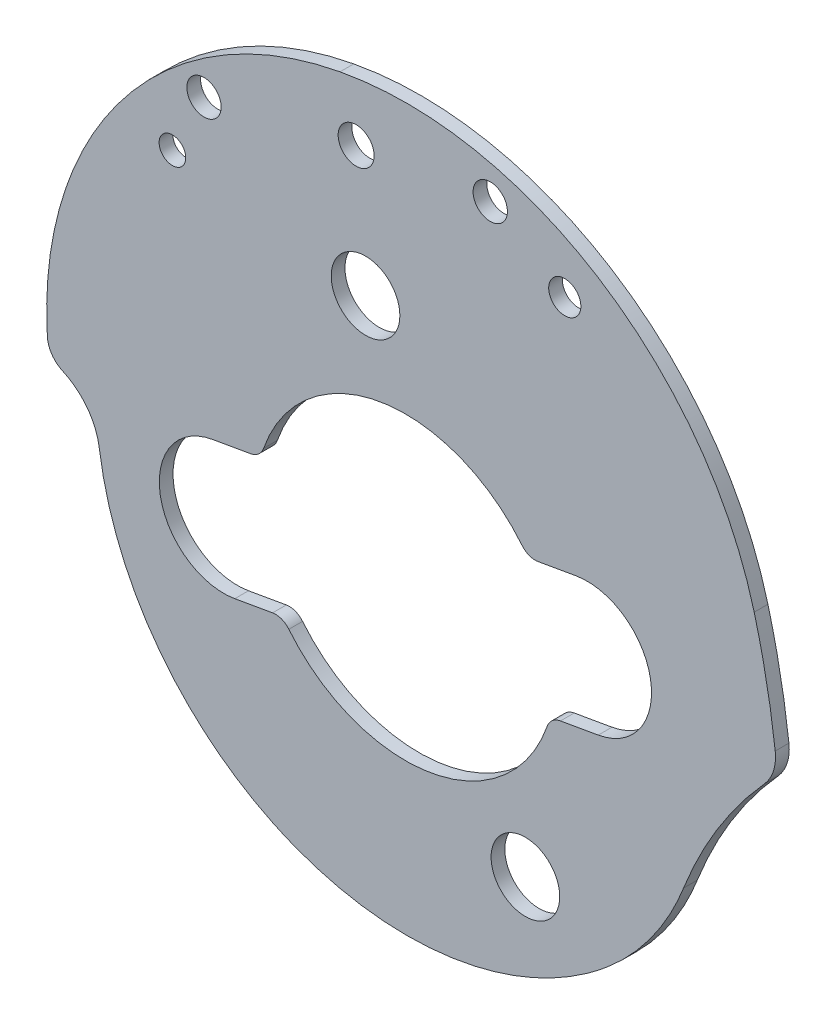
ISO-10303-21;
HEADER;
FILE_DESCRIPTION(('STEP AP214'),'2;1');
FILE_NAME('part.step','',(''),(''),'','','');
FILE_SCHEMA(('AUTOMOTIVE_DESIGN { 1 0 10303 214 1 1 1 1 }'));
ENDSEC;
DATA;
#1=APPLICATION_CONTEXT('core data for automotive mechanical design processes');
#2=APPLICATION_PROTOCOL_DEFINITION('international standard','automotive_design',2000,#1);
#3=PRODUCT_CONTEXT('',#1,'mechanical');
#4=PRODUCT('Part','Part','',(#3));
#5=PRODUCT_RELATED_PRODUCT_CATEGORY('part','',(#4));
#6=PRODUCT_DEFINITION_FORMATION('','',#4);
#7=PRODUCT_DEFINITION_CONTEXT('part definition',#1,'design');
#8=PRODUCT_DEFINITION('design','',#6,#7);
#9=PRODUCT_DEFINITION_SHAPE('','',#8);
#10=(LENGTH_UNIT() NAMED_UNIT(*) SI_UNIT(.MILLI.,.METRE.));
#11=(NAMED_UNIT(*) PLANE_ANGLE_UNIT() SI_UNIT($,.RADIAN.));
#12=(NAMED_UNIT(*) SI_UNIT($,.STERADIAN.) SOLID_ANGLE_UNIT());
#13=UNCERTAINTY_MEASURE_WITH_UNIT(LENGTH_MEASURE(1.E-05),#10,'distance_accuracy_value','');
#14=(GEOMETRIC_REPRESENTATION_CONTEXT(3) GLOBAL_UNCERTAINTY_ASSIGNED_CONTEXT((#13)) GLOBAL_UNIT_ASSIGNED_CONTEXT((#10,
#11,#12)) REPRESENTATION_CONTEXT('',''));
#15=CARTESIAN_POINT('',(0.,0.,0.));
#16=DIRECTION('',(0.,0.,1.));
#17=DIRECTION('',(1.,0.,0.));
#18=AXIS2_PLACEMENT_3D('',#15,#16,#17);
#19=CARTESIAN_POINT('',(46.7562,-26.4745,1.6));
#20=CARTESIAN_POINT('',(46.284,-21.3612,1.6));
#21=CARTESIAN_POINT('',(45.3815,-16.2969,1.6));
#22=CARTESIAN_POINT('',(44.0581,-11.3354,1.6));
#23=B_SPLINE_CURVE_WITH_KNOTS('',3,(#19,#20,#21,#22),.UNSPECIFIED.,.F.,.F.,(4,4),(0.,1.),.UNSPECIFIED.);
#24=DIRECTION('',(0.,0.,-1.));
#25=VECTOR('',#24,1.);
#26=SURFACE_OF_LINEAR_EXTRUSION('',#23,#25);
#27=CARTESIAN_POINT('',(46.5081974861187,-24.1220332329318,1.6));
#28=VERTEX_POINT('',#27);
#29=CARTESIAN_POINT('',(44.0581,-11.3354,1.6));
#30=VERTEX_POINT('',#29);
#31=EDGE_CURVE('E306',#28,#30,#23,.T.);
#32=ORIENTED_EDGE('',*,*,#31,.F.);
#33=DIRECTION('',(0.,0.,-1.));
#34=VECTOR('',#33,1.);
#35=CARTESIAN_POINT('',(46.5081974861187,-24.1220332329318,1.6));
#36=LINE('',#35,#34);
#37=CARTESIAN_POINT('',(46.5081974861187,-24.1220332329318,0.));
#38=VERTEX_POINT('',#37);
#39=EDGE_CURVE('E349',#28,#38,#36,.T.);
#40=ORIENTED_EDGE('',*,*,#39,.T.);
#41=CARTESIAN_POINT('',(46.7562,-26.4745,0.));
#42=CARTESIAN_POINT('',(46.284,-21.3612,0.));
#43=CARTESIAN_POINT('',(45.3815,-16.2969,0.));
#44=CARTESIAN_POINT('',(44.0581,-11.3354,0.));
#45=B_SPLINE_CURVE_WITH_KNOTS('',3,(#41,#42,#43,#44),.UNSPECIFIED.,.F.,.F.,(4,4),(0.,1.),.UNSPECIFIED.);
#46=CARTESIAN_POINT('',(44.0581,-11.3354,0.));
#47=VERTEX_POINT('',#46);
#48=EDGE_CURVE('E303',#38,#47,#45,.T.);
#49=ORIENTED_EDGE('',*,*,#48,.T.);
#50=DIRECTION('',(0.,0.,-1.));
#51=VECTOR('',#50,1.);
#52=CARTESIAN_POINT('',(44.0581,-11.3354,1.6));
#53=LINE('',#52,#51);
#54=EDGE_CURVE('E359',#30,#47,#53,.T.);
#55=ORIENTED_EDGE('',*,*,#54,.F.);
#56=EDGE_LOOP('',(#32,#40,#49,#55));
#57=FACE_BOUND('',#56,.T.);
#58=ADVANCED_FACE('F35',(#57),#26,.F.);
#59=CARTESIAN_POINT('',(44.0581,-11.3354,1.6));
#60=CARTESIAN_POINT('',(38.4033,9.8661,1.6));
#61=CARTESIAN_POINT('',(17.3587,23.1222,1.6));
#62=CARTESIAN_POINT('',(-4.2058,19.0663,1.6));
#63=B_SPLINE_CURVE_WITH_KNOTS('',3,(#59,#60,#61,#62),.UNSPECIFIED.,.F.,.F.,(4,4),(0.,
0.333333333333333),.UNSPECIFIED.);
#64=DIRECTION('',(0.,0.,-1.));
#65=VECTOR('',#64,1.);
#66=SURFACE_OF_LINEAR_EXTRUSION('',#63,#65);
#67=CARTESIAN_POINT('',(44.0581,-11.3354,0.));
#68=CARTESIAN_POINT('',(38.4033,9.8661,0.));
#69=CARTESIAN_POINT('',(17.3587,23.1222,0.));
#70=CARTESIAN_POINT('',(-4.2058,19.0663,0.));
#71=B_SPLINE_CURVE_WITH_KNOTS('',3,(#67,#68,#69,#70),.UNSPECIFIED.,.F.,.F.,(4,4),(0.,
0.333333333333333),.UNSPECIFIED.);
#72=CARTESIAN_POINT('',(-4.2058,19.0663,0.));
#73=VERTEX_POINT('',#72);
#74=EDGE_CURVE('E418',#47,#73,#71,.T.);
#75=ORIENTED_EDGE('',*,*,#74,.T.);
#76=DIRECTION('',(0.,0.,-1.));
#77=VECTOR('',#76,1.);
#78=CARTESIAN_POINT('',(-4.2058,19.0663,1.6));
#79=LINE('',#78,#77);
#80=CARTESIAN_POINT('',(-4.2058,19.0663,1.6));
#81=VERTEX_POINT('',#80);
#82=EDGE_CURVE('E362',#81,#73,#79,.T.);
#83=ORIENTED_EDGE('',*,*,#82,.F.);
#84=EDGE_CURVE('E311',#30,#81,#63,.T.);
#85=ORIENTED_EDGE('',*,*,#84,.F.);
#86=ORIENTED_EDGE('',*,*,#54,.T.);
#87=EDGE_LOOP('',(#75,#83,#85,#86));
#88=FACE_BOUND('',#87,.T.);
#89=ADVANCED_FACE('F323',(#88),#66,.F.);
#90=CARTESIAN_POINT('',(-4.2058,19.0663,1.6));
#91=CARTESIAN_POINT('',(-25.7703,15.0105,1.6));
#92=CARTESIAN_POINT('',(-40.5609,-4.9853,1.6));
#93=CARTESIAN_POINT('',(-38.1268,-26.7925,1.6));
#94=B_SPLINE_CURVE_WITH_KNOTS('',3,(#90,#91,#92,#93),.UNSPECIFIED.,.F.,.F.,(4,4),
(0.333333333333333,1.),.UNSPECIFIED.);
#95=DIRECTION('',(0.,0.,-1.));
#96=VECTOR('',#95,1.);
#97=SURFACE_OF_LINEAR_EXTRUSION('',#94,#96);
#98=CARTESIAN_POINT('',(-4.2058,19.0663,0.));
#99=CARTESIAN_POINT('',(-25.7703,15.0105,0.));
#100=CARTESIAN_POINT('',(-40.5609,-4.9853,0.));
#101=CARTESIAN_POINT('',(-38.1268,-26.7925,0.));
#102=B_SPLINE_CURVE_WITH_KNOTS('',3,(#98,#99,#100,#101),.UNSPECIFIED.,.F.,.F.,(4,4),
(0.333333333333333,1.),.UNSPECIFIED.);
#103=CARTESIAN_POINT('',(-38.3059226082836,-24.7368014436099,0.));
#104=VERTEX_POINT('',#103);
#105=EDGE_CURVE('E410',#73,#104,#102,.T.);
#106=ORIENTED_EDGE('',*,*,#105,.T.);
#107=DIRECTION('',(0.,0.,-1.));
#108=VECTOR('',#107,1.);
#109=CARTESIAN_POINT('',(-38.3059226082836,-24.7368014436097,0.));
#110=LINE('',#109,#108);
#111=CARTESIAN_POINT('',(-38.3059226082836,-24.7368014436099,1.6));
#112=VERTEX_POINT('',#111);
#113=EDGE_CURVE('E342',#104,#112,#110,.F.);
#114=ORIENTED_EDGE('',*,*,#113,.T.);
#115=EDGE_CURVE('E483',#81,#112,#94,.T.);
#116=ORIENTED_EDGE('',*,*,#115,.F.);
#117=ORIENTED_EDGE('',*,*,#82,.T.);
#118=EDGE_LOOP('',(#106,#114,#116,#117));
#119=FACE_BOUND('',#118,.T.);
#120=ADVANCED_FACE('F492',(#119),#97,.F.);
#121=CARTESIAN_POINT('',(-32.2525,-32.9684,1.6));
#122=CARTESIAN_POINT('',(-32.6837,-29.8631,1.6));
#123=CARTESIAN_POINT('',(-35.047,-27.3785,1.6));
#124=CARTESIAN_POINT('',(-38.1268,-26.7925,1.6));
#125=B_SPLINE_CURVE_WITH_KNOTS('',3,(#121,#122,#123,#124),.UNSPECIFIED.,.F.,.F.,(4,4),(0.,1.),.UNSPECIFIED.);
#126=DIRECTION('',(0.,0.,-1.));
#127=VECTOR('',#126,1.);
#128=SURFACE_OF_LINEAR_EXTRUSION('',#125,#127);
#129=CARTESIAN_POINT('',(-32.2525,-32.9684,1.6));
#130=VERTEX_POINT('',#129);
#131=CARTESIAN_POINT('',(-36.5281977495849,-27.2914484952309,1.6));
#132=VERTEX_POINT('',#131);
#133=EDGE_CURVE('E476',#130,#132,#125,.T.);
#134=ORIENTED_EDGE('',*,*,#133,.T.);
#135=DIRECTION('',(0.,0.,-1.));
#136=VECTOR('',#135,1.);
#137=CARTESIAN_POINT('',(-36.5281977495849,-27.291448495231,1.6));
#138=LINE('',#137,#136);
#139=CARTESIAN_POINT('',(-36.5281977495849,-27.2914484952309,0.));
#140=VERTEX_POINT('',#139);
#141=EDGE_CURVE('E344',#132,#140,#138,.T.);
#142=ORIENTED_EDGE('',*,*,#141,.T.);
#143=CARTESIAN_POINT('',(-32.2525,-32.9684,0.));
#144=CARTESIAN_POINT('',(-32.6837,-29.8631,0.));
#145=CARTESIAN_POINT('',(-35.047,-27.3785,0.));
#146=CARTESIAN_POINT('',(-38.1268,-26.7925,0.));
#147=B_SPLINE_CURVE_WITH_KNOTS('',3,(#143,#144,#145,#146),.UNSPECIFIED.,.F.,.F.,(4,4),(0.,1.),.UNSPECIFIED.);
#148=CARTESIAN_POINT('',(-32.2525,-32.9684,0.));
#149=VERTEX_POINT('',#148);
#150=EDGE_CURVE('E402',#149,#140,#147,.T.);
#151=ORIENTED_EDGE('',*,*,#150,.F.);
#152=DIRECTION('',(0.,0.,-1.));
#153=VECTOR('',#152,1.);
#154=CARTESIAN_POINT('',(-32.2525,-32.9684,1.6));
#155=LINE('',#154,#153);
#156=EDGE_CURVE('E365',#130,#149,#155,.T.);
#157=ORIENTED_EDGE('',*,*,#156,.F.);
#158=EDGE_LOOP('',(#134,#142,#151,#157));
#159=FACE_BOUND('',#158,.T.);
#160=ADVANCED_FACE('F490',(#159),#128,.T.);
#161=CARTESIAN_POINT('',(-32.2525,-32.9684,1.6));
#162=CARTESIAN_POINT('',(-30.442,-46.0069,1.6));
#163=CARTESIAN_POINT('',(-21.6996,-57.0365,1.6));
#164=CARTESIAN_POINT('',(-9.4187,-61.7758,1.6));
#165=B_SPLINE_CURVE_WITH_KNOTS('',3,(#161,#162,#163,#164),.UNSPECIFIED.,.F.,.F.,(4,4),(0.,
0.333333333333333),.UNSPECIFIED.);
#166=DIRECTION('',(0.,0.,-1.));
#167=VECTOR('',#166,1.);
#168=SURFACE_OF_LINEAR_EXTRUSION('',#165,#167);
#169=CARTESIAN_POINT('',(-32.2525,-32.9684,0.));
#170=CARTESIAN_POINT('',(-30.442,-46.0069,0.));
#171=CARTESIAN_POINT('',(-21.6996,-57.0365,0.));
#172=CARTESIAN_POINT('',(-9.4187,-61.7758,0.));
#173=B_SPLINE_CURVE_WITH_KNOTS('',3,(#169,#170,#171,#172),.UNSPECIFIED.,.F.,.F.,(4,4),(0.,
0.333333333333333),.UNSPECIFIED.);
#174=CARTESIAN_POINT('',(-9.4187,-61.7758,0.));
#175=VERTEX_POINT('',#174);
#176=EDGE_CURVE('E395',#149,#175,#173,.T.);
#177=ORIENTED_EDGE('',*,*,#176,.T.);
#178=DIRECTION('',(0.,0.,-1.));
#179=VECTOR('',#178,1.);
#180=CARTESIAN_POINT('',(-9.4187,-61.7758,1.6));
#181=LINE('',#180,#179);
#182=CARTESIAN_POINT('',(-9.4187,-61.7758,1.6));
#183=VERTEX_POINT('',#182);
#184=EDGE_CURVE('E367',#183,#175,#181,.T.);
#185=ORIENTED_EDGE('',*,*,#184,.F.);
#186=EDGE_CURVE('E468',#130,#183,#165,.T.);
#187=ORIENTED_EDGE('',*,*,#186,.F.);
#188=ORIENTED_EDGE('',*,*,#156,.T.);
#189=EDGE_LOOP('',(#177,#185,#187,#188));
#190=FACE_BOUND('',#189,.T.);
#191=ADVANCED_FACE('F460',(#190),#168,.F.);
#192=CARTESIAN_POINT('',(-9.4187,-61.7758,1.6));
#193=CARTESIAN_POINT('',(2.8622,-66.5152,1.6));
#194=CARTESIAN_POINT('',(16.7476,-64.218,1.6));
#195=CARTESIAN_POINT('',(26.8478,-55.776,1.6));
#196=B_SPLINE_CURVE_WITH_KNOTS('',3,(#192,#193,#194,#195),.UNSPECIFIED.,.F.,.F.,(4,4),
(0.333333333333333,1.),.UNSPECIFIED.);
#197=DIRECTION('',(0.,0.,-1.));
#198=VECTOR('',#197,1.);
#199=SURFACE_OF_LINEAR_EXTRUSION('',#196,#198);
#200=CARTESIAN_POINT('',(-9.4187,-61.7758,0.));
#201=CARTESIAN_POINT('',(2.8622,-66.5152,0.));
#202=CARTESIAN_POINT('',(16.7476,-64.218,0.));
#203=CARTESIAN_POINT('',(26.8478,-55.776,0.));
#204=B_SPLINE_CURVE_WITH_KNOTS('',3,(#200,#201,#202,#203),.UNSPECIFIED.,.F.,.F.,(4,4),
(0.333333333333333,1.),.UNSPECIFIED.);
#205=CARTESIAN_POINT('',(26.8478,-55.776,0.));
#206=VERTEX_POINT('',#205);
#207=EDGE_CURVE('E388',#175,#206,#204,.T.);
#208=ORIENTED_EDGE('',*,*,#207,.T.);
#209=DIRECTION('',(0.,0.,-1.));
#210=VECTOR('',#209,1.);
#211=CARTESIAN_POINT('',(26.8478,-55.776,1.6));
#212=LINE('',#211,#210);
#213=CARTESIAN_POINT('',(26.8478,-55.776,1.6));
#214=VERTEX_POINT('',#213);
#215=EDGE_CURVE('E370',#214,#206,#212,.T.);
#216=ORIENTED_EDGE('',*,*,#215,.F.);
#217=EDGE_CURVE('E464',#183,#214,#196,.T.);
#218=ORIENTED_EDGE('',*,*,#217,.F.);
#219=ORIENTED_EDGE('',*,*,#184,.T.);
#220=EDGE_LOOP('',(#208,#216,#218,#219));
#221=FACE_BOUND('',#220,.T.);
#222=ADVANCED_FACE('F456',(#221),#199,.F.);
#223=CARTESIAN_POINT('',(26.8478,-55.776,1.6));
#224=CARTESIAN_POINT('',(30.8425,-52.4371,1.6));
#225=CARTESIAN_POINT('',(33.9303,-48.1443,1.6));
#226=CARTESIAN_POINT('',(35.8253,-43.295,1.6));
#227=B_SPLINE_CURVE_WITH_KNOTS('',3,(#223,#224,#225,#226),.UNSPECIFIED.,.F.,.F.,(4,4),(0.,1.),.UNSPECIFIED.);
#228=DIRECTION('',(0.,0.,-1.));
#229=VECTOR('',#228,1.);
#230=SURFACE_OF_LINEAR_EXTRUSION('',#227,#229);
#231=CARTESIAN_POINT('',(26.8478,-55.776,0.));
#232=CARTESIAN_POINT('',(30.8425,-52.4371,0.));
#233=CARTESIAN_POINT('',(33.9303,-48.1443,0.));
#234=CARTESIAN_POINT('',(35.8253,-43.295,0.));
#235=B_SPLINE_CURVE_WITH_KNOTS('',3,(#231,#232,#233,#234),.UNSPECIFIED.,.F.,.F.,(4,4),(0.,1.),.UNSPECIFIED.);
#236=CARTESIAN_POINT('',(35.8253,-43.295,0.));
#237=VERTEX_POINT('',#236);
#238=EDGE_CURVE('E380',#206,#237,#235,.T.);
#239=ORIENTED_EDGE('',*,*,#238,.T.);
#240=DIRECTION('',(0.,0.,-1.));
#241=VECTOR('',#240,1.);
#242=CARTESIAN_POINT('',(35.8253,-43.295,1.6));
#243=LINE('',#242,#241);
#244=CARTESIAN_POINT('',(35.8253,-43.295,1.6));
#245=VERTEX_POINT('',#244);
#246=EDGE_CURVE('E373',#245,#237,#243,.T.);
#247=ORIENTED_EDGE('',*,*,#246,.F.);
#248=EDGE_CURVE('E438',#214,#245,#227,.T.);
#249=ORIENTED_EDGE('',*,*,#248,.F.);
#250=ORIENTED_EDGE('',*,*,#215,.T.);
#251=EDGE_LOOP('',(#239,#247,#249,#250));
#252=FACE_BOUND('',#251,.T.);
#253=ADVANCED_FACE('F452',(#252),#230,.F.);
#254=CARTESIAN_POINT('',(46.7562,-26.4745,1.6));
#255=CARTESIAN_POINT('',(42.0043,-31.2778,1.6));
#256=CARTESIAN_POINT('',(38.2846,-37.0019,1.6));
#257=CARTESIAN_POINT('',(35.8253,-43.295,1.6));
#258=B_SPLINE_CURVE_WITH_KNOTS('',3,(#254,#255,#256,#257),.UNSPECIFIED.,.F.,.F.,(4,4),(0.,1.),.UNSPECIFIED.);
#259=DIRECTION('',(0.,0.,-1.));
#260=VECTOR('',#259,1.);
#261=SURFACE_OF_LINEAR_EXTRUSION('',#258,#260);
#262=CARTESIAN_POINT('',(46.7562,-26.4745,0.));
#263=CARTESIAN_POINT('',(42.0043,-31.2778,0.));
#264=CARTESIAN_POINT('',(38.2846,-37.0019,0.));
#265=CARTESIAN_POINT('',(35.8253,-43.295,0.));
#266=B_SPLINE_CURVE_WITH_KNOTS('',3,(#262,#263,#264,#265),.UNSPECIFIED.,.F.,.F.,(4,4),(0.,1.),.UNSPECIFIED.);
#267=CARTESIAN_POINT('',(45.2494431538167,-28.0664643177123,0.));
#268=VERTEX_POINT('',#267);
#269=EDGE_CURVE('E312',#268,#237,#266,.T.);
#270=ORIENTED_EDGE('',*,*,#269,.F.);
#271=DIRECTION('',(0.,0.,-1.));
#272=VECTOR('',#271,1.);
#273=CARTESIAN_POINT('',(45.2494431538167,-28.0664643177123,0.));
#274=LINE('',#273,#272);
#275=CARTESIAN_POINT('',(45.2494431538167,-28.0664643177123,1.6));
#276=VERTEX_POINT('',#275);
#277=EDGE_CURVE('E43',#268,#276,#274,.F.);
#278=ORIENTED_EDGE('',*,*,#277,.T.);
#279=EDGE_CURVE('E376',#276,#245,#258,.T.);
#280=ORIENTED_EDGE('',*,*,#279,.T.);
#281=ORIENTED_EDGE('',*,*,#246,.T.);
#282=EDGE_LOOP('',(#270,#278,#280,#281));
#283=FACE_BOUND('',#282,.T.);
#284=ADVANCED_FACE('F447',(#283),#261,.T.);
#285=CARTESIAN_POINT('',(45.72635,-18.848025,1.6));
#286=DIRECTION('',(0.,0.,-1.));
#287=DIRECTION('',(-1.,0.,0.));
#288=AXIS2_PLACEMENT_3D('',#285,#286,#287);
#289=PLANE('',#288);
#290=CARTESIAN_POINT('',(21.9842645546393,9.42061545515757,1.6));
#291=DIRECTION('',(0.,0.,1.));
#292=DIRECTION('',(1.,0.,0.));
#293=AXIS2_PLACEMENT_3D('',#290,#291,#292);
#294=CIRCLE('',#293,1.87434087718571);
#295=CARTESIAN_POINT('',(23.858605431825,9.42061545515757,1.6));
#296=VERTEX_POINT('',#295);
#297=EDGE_CURVE('E788',#296,#296,#294,.T.);
#298=ORIENTED_EDGE('',*,*,#297,.F.);
#299=EDGE_LOOP('',(#298));
#300=FACE_BOUND('',#299,.T.);
#301=CARTESIAN_POINT('',(-2.32825813054749,12.5764127669655,1.6));
#302=DIRECTION('',(0.,0.,1.));
#303=DIRECTION('',(1.,0.,0.));
#304=AXIS2_PLACEMENT_3D('',#301,#302,#303);
#305=CIRCLE('',#304,2.09692030355383);
#306=CARTESIAN_POINT('',(-0.231337826993659,12.5764127669655,1.6));
#307=VERTEX_POINT('',#306);
#308=EDGE_CURVE('E781',#307,#307,#305,.T.);
#309=ORIENTED_EDGE('',*,*,#308,.F.);
#310=EDGE_LOOP('',(#309));
#311=FACE_BOUND('',#310,.T.);
#312=CARTESIAN_POINT('',(-23.7377198075075,1.38902165297499,1.6));
#313=DIRECTION('',(0.,0.,1.));
#314=DIRECTION('',(1.,0.,0.));
#315=AXIS2_PLACEMENT_3D('',#312,#313,#314);
#316=CIRCLE('',#315,1.55124076309298);
#317=CARTESIAN_POINT('',(-22.1864790444145,1.38902165297499,1.6));
#318=VERTEX_POINT('',#317);
#319=EDGE_CURVE('E785',#318,#318,#316,.T.);
#320=ORIENTED_EDGE('',*,*,#319,.F.);
#321=EDGE_LOOP('',(#320));
#322=FACE_BOUND('',#321,.T.);
#323=CARTESIAN_POINT('',(13.2993,14.7207,1.6));
#324=DIRECTION('',(0.,0.,1.));
#325=DIRECTION('',(1.,0.,0.));
#326=AXIS2_PLACEMENT_3D('',#323,#324,#325);
#327=CIRCLE('',#326,2.);
#328=CARTESIAN_POINT('',(15.2993,14.7207,1.6));
#329=VERTEX_POINT('',#328);
#330=EDGE_CURVE('E795',#329,#329,#327,.T.);
#331=ORIENTED_EDGE('',*,*,#330,.F.);
#332=EDGE_LOOP('',(#331));
#333=FACE_BOUND('',#332,.T.);
#334=CARTESIAN_POINT('',(-20.0573,8.5758,1.6));
#335=DIRECTION('',(0.,0.,1.));
#336=DIRECTION('',(1.,0.,0.));
#337=AXIS2_PLACEMENT_3D('',#334,#335,#336);
#338=CIRCLE('',#337,2.);
#339=CARTESIAN_POINT('',(-18.0573,8.5758,1.6));
#340=VERTEX_POINT('',#339);
#341=EDGE_CURVE('E214',#340,#340,#338,.T.);
#342=ORIENTED_EDGE('',*,*,#341,.F.);
#343=EDGE_LOOP('',(#342));
#344=FACE_BOUND('',#343,.T.);
#345=DIRECTION('',(0.985031876761154,0.172372276669998,0.));
#346=VECTOR('',#345,1.);
#347=CARTESIAN_POINT('',(21.4821804871443,-33.5955949775209,1.6));
#348=LINE('',#347,#346);
#349=CARTESIAN_POINT('',(21.4821804871443,-33.5955949775209,1.6));
#350=VERTEX_POINT('',#349);
#351=CARTESIAN_POINT('',(25.8858774253898,-32.8249851273037,1.6));
#352=VERTEX_POINT('',#351);
#353=EDGE_CURVE('E243',#350,#352,#348,.T.);
#354=ORIENTED_EDGE('',*,*,#353,.F.);
#355=CARTESIAN_POINT('',(21.8269250404843,-35.5656587310432,1.6));
#356=DIRECTION('',(0.,0.,-1.));
#357=DIRECTION('',(1.,0.,0.));
#358=AXIS2_PLACEMENT_3D('',#355,#356,#357);
#359=CIRCLE('',#358,2.);
#360=CARTESIAN_POINT('',(19.9385122158192,-34.9069501432439,1.6));
#361=VERTEX_POINT('',#360);
#362=EDGE_CURVE('E189',#361,#350,#359,.T.);
#363=ORIENTED_EDGE('',*,*,#362,.F.);
#364=CARTESIAN_POINT('',(3.4149,-29.14325,1.6));
#365=DIRECTION('',(0.,0.,1.));
#366=DIRECTION('',(1.,0.,0.));
#367=AXIS2_PLACEMENT_3D('',#364,#365,#366);
#368=CIRCLE('',#367,17.5);
#369=CARTESIAN_POINT('',(-10.1695439084975,-40.1756062169142,1.6));
#370=VERTEX_POINT('',#369);
#371=EDGE_CURVE('E208',#370,#361,#368,.T.);
#372=ORIENTED_EDGE('',*,*,#371,.F.);
#373=CARTESIAN_POINT('',(-11.7220517837543,-41.4364469274187,1.6));
#374=DIRECTION('',(0.,0.,-1.));
#375=DIRECTION('',(1.,0.,0.));
#376=AXIS2_PLACEMENT_3D('',#373,#374,#375);
#377=CIRCLE('',#376,2.00000000000001);
#378=CARTESIAN_POINT('',(-12.0667963370943,-39.4663831738964,1.6));
#379=VERTEX_POINT('',#378);
#380=EDGE_CURVE('E211',#379,#370,#377,.T.);
#381=ORIENTED_EDGE('',*,*,#380,.F.);
#382=DIRECTION('',(0.985031876761154,0.172372276669998,0.));
#383=VECTOR('',#382,1.);
#384=CARTESIAN_POINT('',(-16.4704932753399,-40.2369930241136,1.6));
#385=LINE('',#384,#383);
#386=CARTESIAN_POINT('',(-16.4704932753399,-40.2369930241136,1.6));
#387=VERTEX_POINT('',#386);
#388=EDGE_CURVE('E267',#387,#379,#385,.T.);
#389=ORIENTED_EDGE('',*,*,#388,.F.);
#390=CARTESIAN_POINT('',(-17.7632853503648,-32.849253948405,1.6));
#391=DIRECTION('',(0.,0.,1.));
#392=DIRECTION('',(1.,0.,0.));
#393=AXIS2_PLACEMENT_3D('',#390,#391,#392);
#394=CIRCLE('',#393,7.5);
#395=CARTESIAN_POINT('',(-19.0560774253898,-25.4615148726963,1.6));
#396=VERTEX_POINT('',#395);
#397=EDGE_CURVE('E264',#396,#387,#394,.T.);
#398=ORIENTED_EDGE('',*,*,#397,.F.);
#399=DIRECTION('',(-0.985031876761154,-0.172372276669997,0.));
#400=VECTOR('',#399,1.);
#401=CARTESIAN_POINT('',(-19.0560774253898,-25.4615148726963,1.6));
#402=LINE('',#401,#400);
#403=CARTESIAN_POINT('',(-14.6523804871443,-24.6909050224791,1.6));
#404=VERTEX_POINT('',#403);
#405=EDGE_CURVE('E261',#404,#396,#402,.T.);
#406=ORIENTED_EDGE('',*,*,#405,.F.);
#407=CARTESIAN_POINT('',(-14.9971250404843,-22.7208412689568,1.6));
#408=DIRECTION('',(0.,0.,-1.));
#409=DIRECTION('',(1.,0.,0.));
#410=AXIS2_PLACEMENT_3D('',#407,#408,#409);
#411=CIRCLE('',#410,2.);
#412=CARTESIAN_POINT('',(-13.1087122158192,-23.3795498567561,1.6));
#413=VERTEX_POINT('',#412);
#414=EDGE_CURVE('E258',#413,#404,#411,.T.);
#415=ORIENTED_EDGE('',*,*,#414,.F.);
#416=CARTESIAN_POINT('',(3.4149,-29.14325,1.6));
#417=DIRECTION('',(0.,0.,1.));
#418=DIRECTION('',(1.,0.,0.));
#419=AXIS2_PLACEMENT_3D('',#416,#417,#418);
#420=CIRCLE('',#419,17.5);
#421=CARTESIAN_POINT('',(16.9993439084975,-18.1108937830858,1.6));
#422=VERTEX_POINT('',#421);
#423=EDGE_CURVE('E255',#422,#413,#420,.T.);
#424=ORIENTED_EDGE('',*,*,#423,.F.);
#425=CARTESIAN_POINT('',(18.5518517837543,-16.8500530725813,1.6));
#426=DIRECTION('',(0.,0.,-1.));
#427=DIRECTION('',(1.,0.,0.));
#428=AXIS2_PLACEMENT_3D('',#425,#426,#427);
#429=CIRCLE('',#428,2.);
#430=CARTESIAN_POINT('',(18.8965963370943,-18.8201168261036,1.6));
#431=VERTEX_POINT('',#430);
#432=EDGE_CURVE('E252',#431,#422,#429,.T.);
#433=ORIENTED_EDGE('',*,*,#432,.F.);
#434=DIRECTION('',(-0.985031876761154,-0.172372276669998,0.));
#435=VECTOR('',#434,1.);
#436=CARTESIAN_POINT('',(18.8965963370943,-18.8201168261036,1.6));
#437=LINE('',#436,#435);
#438=CARTESIAN_POINT('',(23.3002932753398,-18.0495069758864,1.6));
#439=VERTEX_POINT('',#438);
#440=EDGE_CURVE('E249',#439,#431,#437,.T.);
#441=ORIENTED_EDGE('',*,*,#440,.F.);
#442=CARTESIAN_POINT('',(24.5930853503648,-25.4372460515951,1.6));
#443=DIRECTION('',(0.,0.,1.));
#444=DIRECTION('',(1.,0.,0.));
#445=AXIS2_PLACEMENT_3D('',#442,#443,#444);
#446=CIRCLE('',#445,7.49999999999999);
#447=EDGE_CURVE('E246',#352,#439,#446,.T.);
#448=ORIENTED_EDGE('',*,*,#447,.F.);
#449=EDGE_LOOP('',(#354,#363,#372,#381,#389,#398,#406,#415,#424,#433,#441,#448));
#450=FACE_BOUND('',#449,.T.);
#451=CARTESIAN_POINT('',(-1.2327,-2.0433,1.6));
#452=DIRECTION('',(0.,0.,1.));
#453=DIRECTION('',(1.,0.,0.));
#454=AXIS2_PLACEMENT_3D('',#451,#452,#453);
#455=CIRCLE('',#454,4.);
#456=CARTESIAN_POINT('',(2.7673,-2.0433,1.6));
#457=VERTEX_POINT('',#456);
#458=EDGE_CURVE('E274',#457,#457,#455,.T.);
#459=ORIENTED_EDGE('',*,*,#458,.F.);
#460=EDGE_LOOP('',(#459));
#461=FACE_BOUND('',#460,.T.);
#462=CARTESIAN_POINT('',(17.3961,-51.3806,1.6));
#463=DIRECTION('',(0.,0.,1.));
#464=DIRECTION('',(1.,0.,0.));
#465=AXIS2_PLACEMENT_3D('',#462,#463,#464);
#466=CIRCLE('',#465,4.);
#467=CARTESIAN_POINT('',(21.3961,-51.3806,1.6));
#468=VERTEX_POINT('',#467);
#469=EDGE_CURVE('E297',#468,#468,#466,.T.);
#470=ORIENTED_EDGE('',*,*,#469,.F.);
#471=EDGE_LOOP('',(#470));
#472=FACE_BOUND('',#471,.T.);
#473=ORIENTED_EDGE('',*,*,#279,.F.);
#474=CARTESIAN_POINT('',(41.5429570209345,-24.710579852068,1.6));
#475=DIRECTION('',(0.,0.,-1.));
#476=DIRECTION('',(-1.,0.,0.));
#477=AXIS2_PLACEMENT_3D('',#474,#475,#476);
#478=CIRCLE('',#477,5.);
#479=EDGE_CURVE('E11',#276,#28,#478,.F.);
#480=ORIENTED_EDGE('',*,*,#479,.T.);
#481=ORIENTED_EDGE('',*,*,#31,.T.);
#482=ORIENTED_EDGE('',*,*,#84,.T.);
#483=ORIENTED_EDGE('',*,*,#115,.T.);
#484=CARTESIAN_POINT('',(-35.3117991869055,-24.549118366178,1.6));
#485=DIRECTION('',(0.,0.,-1.));
#486=DIRECTION('',(-1.,0.,0.));
#487=AXIS2_PLACEMENT_3D('',#484,#485,#486);
#488=CIRCLE('',#487,3.);
#489=EDGE_CURVE('E341',#112,#132,#488,.F.);
#490=ORIENTED_EDGE('',*,*,#489,.T.);
#491=ORIENTED_EDGE('',*,*,#133,.F.);
#492=ORIENTED_EDGE('',*,*,#186,.T.);
#493=ORIENTED_EDGE('',*,*,#217,.T.);
#494=ORIENTED_EDGE('',*,*,#248,.T.);
#495=EDGE_LOOP('',(#473,#480,#481,#482,#483,#490,#491,#492,#493,#494));
#496=FACE_BOUND('',#495,.T.);
#497=ADVANCED_FACE('F451',(#300,#311,#322,#333,#344,#450,#461,#472,#496),#289,.F.);
#498=CARTESIAN_POINT('',(45.72635,-18.848025,0.));
#499=DIRECTION('',(0.,0.,-1.));
#500=DIRECTION('',(-1.,0.,0.));
#501=AXIS2_PLACEMENT_3D('',#498,#499,#500);
#502=PLANE('',#501);
#503=CARTESIAN_POINT('',(21.9842645546393,9.42061545515757,0.));
#504=DIRECTION('',(0.,0.,1.));
#505=DIRECTION('',(1.,0.,0.));
#506=AXIS2_PLACEMENT_3D('',#503,#504,#505);
#507=CIRCLE('',#506,1.87434087718571);
#508=CARTESIAN_POINT('',(23.858605431825,9.42061545515757,0.));
#509=VERTEX_POINT('',#508);
#510=EDGE_CURVE('E783',#509,#509,#507,.T.);
#511=ORIENTED_EDGE('',*,*,#510,.T.);
#512=EDGE_LOOP('',(#511));
#513=FACE_BOUND('',#512,.T.);
#514=CARTESIAN_POINT('',(-2.32825813054749,12.5764127669655,0.));
#515=DIRECTION('',(0.,0.,1.));
#516=DIRECTION('',(1.,0.,0.));
#517=AXIS2_PLACEMENT_3D('',#514,#515,#516);
#518=CIRCLE('',#517,2.09692030355383);
#519=CARTESIAN_POINT('',(-0.231337826993659,12.5764127669655,0.));
#520=VERTEX_POINT('',#519);
#521=EDGE_CURVE('E778',#520,#520,#518,.T.);
#522=ORIENTED_EDGE('',*,*,#521,.T.);
#523=EDGE_LOOP('',(#522));
#524=FACE_BOUND('',#523,.T.);
#525=CARTESIAN_POINT('',(-23.7377198075075,1.38902165297499,0.));
#526=DIRECTION('',(0.,0.,1.));
#527=DIRECTION('',(1.,0.,0.));
#528=AXIS2_PLACEMENT_3D('',#525,#526,#527);
#529=CIRCLE('',#528,1.55124076309298);
#530=CARTESIAN_POINT('',(-22.1864790444145,1.38902165297499,0.));
#531=VERTEX_POINT('',#530);
#532=EDGE_CURVE('E792',#531,#531,#529,.T.);
#533=ORIENTED_EDGE('',*,*,#532,.T.);
#534=EDGE_LOOP('',(#533));
#535=FACE_BOUND('',#534,.T.);
#536=CARTESIAN_POINT('',(13.2993,14.7207,0.));
#537=DIRECTION('',(0.,0.,1.));
#538=DIRECTION('',(1.,0.,0.));
#539=AXIS2_PLACEMENT_3D('',#536,#537,#538);
#540=CIRCLE('',#539,2.);
#541=CARTESIAN_POINT('',(15.2993,14.7207,0.));
#542=VERTEX_POINT('',#541);
#543=EDGE_CURVE('E798',#542,#542,#540,.T.);
#544=ORIENTED_EDGE('',*,*,#543,.T.);
#545=EDGE_LOOP('',(#544));
#546=FACE_BOUND('',#545,.T.);
#547=CARTESIAN_POINT('',(-20.0573,8.5758,0.));
#548=DIRECTION('',(0.,0.,1.));
#549=DIRECTION('',(1.,0.,0.));
#550=AXIS2_PLACEMENT_3D('',#547,#548,#549);
#551=CIRCLE('',#550,2.);
#552=CARTESIAN_POINT('',(-18.0573,8.5758,0.));
#553=VERTEX_POINT('',#552);
#554=EDGE_CURVE('E244',#553,#553,#551,.T.);
#555=ORIENTED_EDGE('',*,*,#554,.T.);
#556=EDGE_LOOP('',(#555));
#557=FACE_BOUND('',#556,.T.);
#558=CARTESIAN_POINT('',(21.8269250404843,-35.5656587310432,0.));
#559=DIRECTION('',(0.,0.,-1.));
#560=DIRECTION('',(1.,0.,0.));
#561=AXIS2_PLACEMENT_3D('',#558,#559,#560);
#562=CIRCLE('',#561,2.);
#563=CARTESIAN_POINT('',(19.9385122158192,-34.9069501432439,0.));
#564=VERTEX_POINT('',#563);
#565=CARTESIAN_POINT('',(21.4821804871443,-33.5955949775209,0.));
#566=VERTEX_POINT('',#565);
#567=EDGE_CURVE('E186',#564,#566,#562,.T.);
#568=ORIENTED_EDGE('',*,*,#567,.T.);
#569=DIRECTION('',(0.985031876761154,0.172372276669998,0.));
#570=VECTOR('',#569,1.);
#571=CARTESIAN_POINT('',(21.4821804871443,-33.5955949775209,0.));
#572=LINE('',#571,#570);
#573=CARTESIAN_POINT('',(25.8858774253898,-32.8249851273037,0.));
#574=VERTEX_POINT('',#573);
#575=EDGE_CURVE('E198',#566,#574,#572,.T.);
#576=ORIENTED_EDGE('',*,*,#575,.T.);
#577=CARTESIAN_POINT('',(24.5930853503648,-25.4372460515951,0.));
#578=DIRECTION('',(0.,0.,1.));
#579=DIRECTION('',(1.,0.,0.));
#580=AXIS2_PLACEMENT_3D('',#577,#578,#579);
#581=CIRCLE('',#580,7.49999999999999);
#582=CARTESIAN_POINT('',(23.3002932753398,-18.0495069758864,0.));
#583=VERTEX_POINT('',#582);
#584=EDGE_CURVE('E202',#574,#583,#581,.T.);
#585=ORIENTED_EDGE('',*,*,#584,.T.);
#586=DIRECTION('',(-0.985031876761154,-0.172372276669998,0.));
#587=VECTOR('',#586,1.);
#588=CARTESIAN_POINT('',(18.8965963370943,-18.8201168261036,0.));
#589=LINE('',#588,#587);
#590=CARTESIAN_POINT('',(18.8965963370943,-18.8201168261036,0.));
#591=VERTEX_POINT('',#590);
#592=EDGE_CURVE('E218',#583,#591,#589,.T.);
#593=ORIENTED_EDGE('',*,*,#592,.T.);
#594=CARTESIAN_POINT('',(18.5518517837543,-16.8500530725813,0.));
#595=DIRECTION('',(0.,0.,-1.));
#596=DIRECTION('',(1.,0.,0.));
#597=AXIS2_PLACEMENT_3D('',#594,#595,#596);
#598=CIRCLE('',#597,2.);
#599=CARTESIAN_POINT('',(16.9993439084975,-18.1108937830858,0.));
#600=VERTEX_POINT('',#599);
#601=EDGE_CURVE('E221',#591,#600,#598,.T.);
#602=ORIENTED_EDGE('',*,*,#601,.T.);
#603=CARTESIAN_POINT('',(3.4149,-29.14325,0.));
#604=DIRECTION('',(0.,0.,1.));
#605=DIRECTION('',(1.,0.,0.));
#606=AXIS2_PLACEMENT_3D('',#603,#604,#605);
#607=CIRCLE('',#606,17.5);
#608=CARTESIAN_POINT('',(-13.1087122158192,-23.3795498567561,0.));
#609=VERTEX_POINT('',#608);
#610=EDGE_CURVE('E224',#600,#609,#607,.T.);
#611=ORIENTED_EDGE('',*,*,#610,.T.);
#612=CARTESIAN_POINT('',(-14.9971250404843,-22.7208412689568,0.));
#613=DIRECTION('',(0.,0.,-1.));
#614=DIRECTION('',(1.,0.,0.));
#615=AXIS2_PLACEMENT_3D('',#612,#613,#614);
#616=CIRCLE('',#615,2.);
#617=CARTESIAN_POINT('',(-14.6523804871443,-24.6909050224791,0.));
#618=VERTEX_POINT('',#617);
#619=EDGE_CURVE('E227',#609,#618,#616,.T.);
#620=ORIENTED_EDGE('',*,*,#619,.T.);
#621=DIRECTION('',(-0.985031876761154,-0.172372276669997,0.));
#622=VECTOR('',#621,1.);
#623=CARTESIAN_POINT('',(-19.0560774253898,-25.4615148726963,0.));
#624=LINE('',#623,#622);
#625=CARTESIAN_POINT('',(-19.0560774253898,-25.4615148726963,0.));
#626=VERTEX_POINT('',#625);
#627=EDGE_CURVE('E230',#618,#626,#624,.T.);
#628=ORIENTED_EDGE('',*,*,#627,.T.);
#629=CARTESIAN_POINT('',(-17.7632853503648,-32.849253948405,0.));
#630=DIRECTION('',(0.,0.,1.));
#631=DIRECTION('',(1.,0.,0.));
#632=AXIS2_PLACEMENT_3D('',#629,#630,#631);
#633=CIRCLE('',#632,7.5);
#634=CARTESIAN_POINT('',(-16.4704932753399,-40.2369930241136,0.));
#635=VERTEX_POINT('',#634);
#636=EDGE_CURVE('E233',#626,#635,#633,.T.);
#637=ORIENTED_EDGE('',*,*,#636,.T.);
#638=DIRECTION('',(0.985031876761154,0.172372276669998,0.));
#639=VECTOR('',#638,1.);
#640=CARTESIAN_POINT('',(-16.4704932753399,-40.2369930241136,0.));
#641=LINE('',#640,#639);
#642=CARTESIAN_POINT('',(-12.0667963370943,-39.4663831738964,0.));
#643=VERTEX_POINT('',#642);
#644=EDGE_CURVE('E236',#635,#643,#641,.T.);
#645=ORIENTED_EDGE('',*,*,#644,.T.);
#646=CARTESIAN_POINT('',(-11.7220517837543,-41.4364469274187,0.));
#647=DIRECTION('',(0.,0.,-1.));
#648=DIRECTION('',(1.,0.,0.));
#649=AXIS2_PLACEMENT_3D('',#646,#647,#648);
#650=CIRCLE('',#649,2.00000000000001);
#651=CARTESIAN_POINT('',(-10.1695439084975,-40.1756062169142,0.));
#652=VERTEX_POINT('',#651);
#653=EDGE_CURVE('E239',#643,#652,#650,.T.);
#654=ORIENTED_EDGE('',*,*,#653,.T.);
#655=CARTESIAN_POINT('',(3.4149,-29.14325,0.));
#656=DIRECTION('',(0.,0.,1.));
#657=DIRECTION('',(1.,0.,0.));
#658=AXIS2_PLACEMENT_3D('',#655,#656,#657);
#659=CIRCLE('',#658,17.5);
#660=EDGE_CURVE('E194',#652,#564,#659,.T.);
#661=ORIENTED_EDGE('',*,*,#660,.T.);
#662=EDGE_LOOP('',(#568,#576,#585,#593,#602,#611,#620,#628,#637,#645,#654,#661));
#663=FACE_BOUND('',#662,.T.);
#664=CARTESIAN_POINT('',(-1.2327,-2.0433,0.));
#665=DIRECTION('',(0.,0.,1.));
#666=DIRECTION('',(1.,0.,0.));
#667=AXIS2_PLACEMENT_3D('',#664,#665,#666);
#668=CIRCLE('',#667,4.);
#669=CARTESIAN_POINT('',(2.7673,-2.0433,0.));
#670=VERTEX_POINT('',#669);
#671=EDGE_CURVE('E294',#670,#670,#668,.T.);
#672=ORIENTED_EDGE('',*,*,#671,.T.);
#673=EDGE_LOOP('',(#672));
#674=FACE_BOUND('',#673,.T.);
#675=CARTESIAN_POINT('',(17.3961,-51.3806,0.));
#676=DIRECTION('',(0.,0.,1.));
#677=DIRECTION('',(1.,0.,0.));
#678=AXIS2_PLACEMENT_3D('',#675,#676,#677);
#679=CIRCLE('',#678,4.);
#680=CARTESIAN_POINT('',(21.3961,-51.3806,0.));
#681=VERTEX_POINT('',#680);
#682=EDGE_CURVE('E300',#681,#681,#679,.T.);
#683=ORIENTED_EDGE('',*,*,#682,.T.);
#684=EDGE_LOOP('',(#683));
#685=FACE_BOUND('',#684,.T.);
#686=ORIENTED_EDGE('',*,*,#48,.F.);
#687=CARTESIAN_POINT('',(41.5429570209345,-24.710579852068,0.));
#688=DIRECTION('',(0.,0.,-1.));
#689=DIRECTION('',(-1.,0.,0.));
#690=AXIS2_PLACEMENT_3D('',#687,#688,#689);
#691=CIRCLE('',#690,5.);
#692=EDGE_CURVE('E57',#38,#268,#691,.T.);
#693=ORIENTED_EDGE('',*,*,#692,.T.);
#694=ORIENTED_EDGE('',*,*,#269,.T.);
#695=ORIENTED_EDGE('',*,*,#238,.F.);
#696=ORIENTED_EDGE('',*,*,#207,.F.);
#697=ORIENTED_EDGE('',*,*,#176,.F.);
#698=ORIENTED_EDGE('',*,*,#150,.T.);
#699=CARTESIAN_POINT('',(-35.3117991869055,-24.549118366178,0.));
#700=DIRECTION('',(0.,0.,-1.));
#701=DIRECTION('',(-1.,0.,0.));
#702=AXIS2_PLACEMENT_3D('',#699,#700,#701);
#703=CIRCLE('',#702,3.);
#704=EDGE_CURVE('E353',#140,#104,#703,.T.);
#705=ORIENTED_EDGE('',*,*,#704,.T.);
#706=ORIENTED_EDGE('',*,*,#105,.F.);
#707=ORIENTED_EDGE('',*,*,#74,.F.);
#708=EDGE_LOOP('',(#686,#693,#694,#695,#696,#697,#698,#705,#706,#707));
#709=FACE_BOUND('',#708,.T.);
#710=ADVANCED_FACE('F204',(#513,#524,#535,#546,#557,#663,#674,#685,#709),#502,.T.);
#711=CARTESIAN_POINT('',(17.3961,-51.3806,0.));
#712=DIRECTION('',(0.,0.,1.));
#713=DIRECTION('',(1.,0.,0.));
#714=AXIS2_PLACEMENT_3D('',#711,#712,#713);
#715=CYLINDRICAL_SURFACE('',#714,4.);
#716=ORIENTED_EDGE('',*,*,#682,.F.);
#717=EDGE_LOOP('',(#716));
#718=FACE_BOUND('',#717,.T.);
#719=ORIENTED_EDGE('',*,*,#469,.T.);
#720=EDGE_LOOP('',(#719));
#721=FACE_BOUND('',#720,.T.);
#722=ADVANCED_FACE('F553',(#718,#721),#715,.F.);
#723=CARTESIAN_POINT('',(-1.2327,-2.0433,0.));
#724=DIRECTION('',(0.,0.,1.));
#725=DIRECTION('',(1.,0.,0.));
#726=AXIS2_PLACEMENT_3D('',#723,#724,#725);
#727=CYLINDRICAL_SURFACE('',#726,4.);
#728=ORIENTED_EDGE('',*,*,#671,.F.);
#729=EDGE_LOOP('',(#728));
#730=FACE_BOUND('',#729,.T.);
#731=ORIENTED_EDGE('',*,*,#458,.T.);
#732=EDGE_LOOP('',(#731));
#733=FACE_BOUND('',#732,.T.);
#734=ADVANCED_FACE('F560',(#730,#733),#727,.F.);
#735=CARTESIAN_POINT('',(21.8269250404843,-35.5656587310432,0.));
#736=DIRECTION('',(0.,0.,1.));
#737=DIRECTION('',(1.,0.,0.));
#738=AXIS2_PLACEMENT_3D('',#735,#736,#737);
#739=CYLINDRICAL_SURFACE('',#738,2.);
#740=ORIENTED_EDGE('',*,*,#362,.T.);
#741=DIRECTION('',(0.,0.,1.));
#742=VECTOR('',#741,1.);
#743=CARTESIAN_POINT('',(21.4821804871443,-33.5955949775209,0.));
#744=LINE('',#743,#742);
#745=EDGE_CURVE('E182',#566,#350,#744,.T.);
#746=ORIENTED_EDGE('',*,*,#745,.F.);
#747=ORIENTED_EDGE('',*,*,#567,.F.);
#748=DIRECTION('',(0.,0.,1.));
#749=VECTOR('',#748,1.);
#750=CARTESIAN_POINT('',(19.9385122158192,-34.9069501432439,0.));
#751=LINE('',#750,#749);
#752=EDGE_CURVE('E272',#564,#361,#751,.T.);
#753=ORIENTED_EDGE('',*,*,#752,.T.);
#754=EDGE_LOOP('',(#740,#746,#747,#753));
#755=FACE_BOUND('',#754,.T.);
#756=ADVANCED_FACE('F184',(#755),#739,.T.);
#757=CARTESIAN_POINT('',(3.4149,-29.14325,0.));
#758=DIRECTION('',(0.,0.,1.));
#759=DIRECTION('',(1.,0.,0.));
#760=AXIS2_PLACEMENT_3D('',#757,#758,#759);
#761=CYLINDRICAL_SURFACE('',#760,17.5);
#762=ORIENTED_EDGE('',*,*,#371,.T.);
#763=ORIENTED_EDGE('',*,*,#752,.F.);
#764=ORIENTED_EDGE('',*,*,#660,.F.);
#765=DIRECTION('',(0.,0.,1.));
#766=VECTOR('',#765,1.);
#767=CARTESIAN_POINT('',(-10.1695439084975,-40.1756062169142,0.));
#768=LINE('',#767,#766);
#769=EDGE_CURVE('E275',#652,#370,#768,.T.);
#770=ORIENTED_EDGE('',*,*,#769,.T.);
#771=EDGE_LOOP('',(#762,#763,#764,#770));
#772=FACE_BOUND('',#771,.T.);
#773=ADVANCED_FACE('F575',(#772),#761,.F.);
#774=CARTESIAN_POINT('',(-11.7220517837543,-41.4364469274187,0.));
#775=DIRECTION('',(0.,0.,1.));
#776=DIRECTION('',(1.,0.,0.));
#777=AXIS2_PLACEMENT_3D('',#774,#775,#776);
#778=CYLINDRICAL_SURFACE('',#777,2.00000000000001);
#779=ORIENTED_EDGE('',*,*,#380,.T.);
#780=ORIENTED_EDGE('',*,*,#769,.F.);
#781=ORIENTED_EDGE('',*,*,#653,.F.);
#782=DIRECTION('',(0.,0.,1.));
#783=VECTOR('',#782,1.);
#784=CARTESIAN_POINT('',(-12.0667963370943,-39.4663831738964,0.));
#785=LINE('',#784,#783);
#786=EDGE_CURVE('E277',#643,#379,#785,.T.);
#787=ORIENTED_EDGE('',*,*,#786,.T.);
#788=EDGE_LOOP('',(#779,#780,#781,#787));
#789=FACE_BOUND('',#788,.T.);
#790=ADVANCED_FACE('F582',(#789),#778,.T.);
#791=CARTESIAN_POINT('',(-16.4704932753399,-40.2369930241136,0.));
#792=DIRECTION('',(0.172372276669998,-0.985031876761154,0.));
#793=DIRECTION('',(0.985031876761154,0.172372276669998,0.));
#794=AXIS2_PLACEMENT_3D('',#791,#792,#793);
#795=PLANE('',#794);
#796=ORIENTED_EDGE('',*,*,#388,.T.);
#797=ORIENTED_EDGE('',*,*,#786,.F.);
#798=ORIENTED_EDGE('',*,*,#644,.F.);
#799=DIRECTION('',(0.,0.,1.));
#800=VECTOR('',#799,1.);
#801=CARTESIAN_POINT('',(-16.4704932753399,-40.2369930241136,0.));
#802=LINE('',#801,#800);
#803=EDGE_CURVE('E279',#635,#387,#802,.T.);
#804=ORIENTED_EDGE('',*,*,#803,.T.);
#805=EDGE_LOOP('',(#796,#797,#798,#804));
#806=FACE_BOUND('',#805,.T.);
#807=ADVANCED_FACE('F590',(#806),#795,.F.);
#808=CARTESIAN_POINT('',(-17.7632853503648,-32.849253948405,0.));
#809=DIRECTION('',(0.,0.,1.));
#810=DIRECTION('',(1.,0.,0.));
#811=AXIS2_PLACEMENT_3D('',#808,#809,#810);
#812=CYLINDRICAL_SURFACE('',#811,7.5);
#813=ORIENTED_EDGE('',*,*,#397,.T.);
#814=ORIENTED_EDGE('',*,*,#803,.F.);
#815=ORIENTED_EDGE('',*,*,#636,.F.);
#816=DIRECTION('',(0.,0.,1.));
#817=VECTOR('',#816,1.);
#818=CARTESIAN_POINT('',(-19.0560774253898,-25.4615148726963,0.));
#819=LINE('',#818,#817);
#820=EDGE_CURVE('E281',#626,#396,#819,.T.);
#821=ORIENTED_EDGE('',*,*,#820,.T.);
#822=EDGE_LOOP('',(#813,#814,#815,#821));
#823=FACE_BOUND('',#822,.T.);
#824=ADVANCED_FACE('F598',(#823),#812,.F.);
#825=CARTESIAN_POINT('',(-19.0560774253898,-25.4615148726963,0.));
#826=DIRECTION('',(-0.172372276669997,0.985031876761154,0.));
#827=DIRECTION('',(-0.985031876761154,-0.172372276669997,0.));
#828=AXIS2_PLACEMENT_3D('',#825,#826,#827);
#829=PLANE('',#828);
#830=ORIENTED_EDGE('',*,*,#405,.T.);
#831=ORIENTED_EDGE('',*,*,#820,.F.);
#832=ORIENTED_EDGE('',*,*,#627,.F.);
#833=DIRECTION('',(0.,0.,1.));
#834=VECTOR('',#833,1.);
#835=CARTESIAN_POINT('',(-14.6523804871443,-24.6909050224791,0.));
#836=LINE('',#835,#834);
#837=EDGE_CURVE('E283',#618,#404,#836,.T.);
#838=ORIENTED_EDGE('',*,*,#837,.T.);
#839=EDGE_LOOP('',(#830,#831,#832,#838));
#840=FACE_BOUND('',#839,.T.);
#841=ADVANCED_FACE('F606',(#840),#829,.F.);
#842=CARTESIAN_POINT('',(-14.9971250404843,-22.7208412689568,0.));
#843=DIRECTION('',(0.,0.,1.));
#844=DIRECTION('',(1.,0.,0.));
#845=AXIS2_PLACEMENT_3D('',#842,#843,#844);
#846=CYLINDRICAL_SURFACE('',#845,2.);
#847=ORIENTED_EDGE('',*,*,#414,.T.);
#848=ORIENTED_EDGE('',*,*,#837,.F.);
#849=ORIENTED_EDGE('',*,*,#619,.F.);
#850=DIRECTION('',(0.,0.,1.));
#851=VECTOR('',#850,1.);
#852=CARTESIAN_POINT('',(-13.1087122158192,-23.3795498567561,0.));
#853=LINE('',#852,#851);
#854=EDGE_CURVE('E285',#609,#413,#853,.T.);
#855=ORIENTED_EDGE('',*,*,#854,.T.);
#856=EDGE_LOOP('',(#847,#848,#849,#855));
#857=FACE_BOUND('',#856,.T.);
#858=ADVANCED_FACE('F614',(#857),#846,.T.);
#859=CARTESIAN_POINT('',(3.4149,-29.14325,0.));
#860=DIRECTION('',(0.,0.,1.));
#861=DIRECTION('',(1.,0.,0.));
#862=AXIS2_PLACEMENT_3D('',#859,#860,#861);
#863=CYLINDRICAL_SURFACE('',#862,17.5);
#864=ORIENTED_EDGE('',*,*,#423,.T.);
#865=ORIENTED_EDGE('',*,*,#854,.F.);
#866=ORIENTED_EDGE('',*,*,#610,.F.);
#867=DIRECTION('',(0.,0.,1.));
#868=VECTOR('',#867,1.);
#869=CARTESIAN_POINT('',(16.9993439084975,-18.1108937830858,0.));
#870=LINE('',#869,#868);
#871=EDGE_CURVE('E287',#600,#422,#870,.T.);
#872=ORIENTED_EDGE('',*,*,#871,.T.);
#873=EDGE_LOOP('',(#864,#865,#866,#872));
#874=FACE_BOUND('',#873,.T.);
#875=ADVANCED_FACE('F622',(#874),#863,.F.);
#876=CARTESIAN_POINT('',(18.5518517837543,-16.8500530725813,0.));
#877=DIRECTION('',(0.,0.,1.));
#878=DIRECTION('',(1.,0.,0.));
#879=AXIS2_PLACEMENT_3D('',#876,#877,#878);
#880=CYLINDRICAL_SURFACE('',#879,2.);
#881=ORIENTED_EDGE('',*,*,#432,.T.);
#882=ORIENTED_EDGE('',*,*,#871,.F.);
#883=ORIENTED_EDGE('',*,*,#601,.F.);
#884=DIRECTION('',(0.,0.,1.));
#885=VECTOR('',#884,1.);
#886=CARTESIAN_POINT('',(18.8965963370943,-18.8201168261036,0.));
#887=LINE('',#886,#885);
#888=EDGE_CURVE('E289',#591,#431,#887,.T.);
#889=ORIENTED_EDGE('',*,*,#888,.T.);
#890=EDGE_LOOP('',(#881,#882,#883,#889));
#891=FACE_BOUND('',#890,.T.);
#892=ADVANCED_FACE('F630',(#891),#880,.T.);
#893=CARTESIAN_POINT('',(18.8965963370943,-18.8201168261036,0.));
#894=DIRECTION('',(-0.172372276669998,0.985031876761154,0.));
#895=DIRECTION('',(-0.985031876761154,-0.172372276669998,0.));
#896=AXIS2_PLACEMENT_3D('',#893,#894,#895);
#897=PLANE('',#896);
#898=ORIENTED_EDGE('',*,*,#440,.T.);
#899=ORIENTED_EDGE('',*,*,#888,.F.);
#900=ORIENTED_EDGE('',*,*,#592,.F.);
#901=DIRECTION('',(0.,0.,1.));
#902=VECTOR('',#901,1.);
#903=CARTESIAN_POINT('',(23.3002932753398,-18.0495069758864,0.));
#904=LINE('',#903,#902);
#905=EDGE_CURVE('E291',#583,#439,#904,.T.);
#906=ORIENTED_EDGE('',*,*,#905,.T.);
#907=EDGE_LOOP('',(#898,#899,#900,#906));
#908=FACE_BOUND('',#907,.T.);
#909=ADVANCED_FACE('F638',(#908),#897,.F.);
#910=CARTESIAN_POINT('',(24.5930853503648,-25.4372460515951,0.));
#911=DIRECTION('',(0.,0.,1.));
#912=DIRECTION('',(1.,0.,0.));
#913=AXIS2_PLACEMENT_3D('',#910,#911,#912);
#914=CYLINDRICAL_SURFACE('',#913,7.49999999999999);
#915=ORIENTED_EDGE('',*,*,#447,.T.);
#916=ORIENTED_EDGE('',*,*,#905,.F.);
#917=ORIENTED_EDGE('',*,*,#584,.F.);
#918=DIRECTION('',(0.,0.,1.));
#919=VECTOR('',#918,1.);
#920=CARTESIAN_POINT('',(25.8858774253898,-32.8249851273037,0.));
#921=LINE('',#920,#919);
#922=EDGE_CURVE('E193',#574,#352,#921,.T.);
#923=ORIENTED_EDGE('',*,*,#922,.T.);
#924=EDGE_LOOP('',(#915,#916,#917,#923));
#925=FACE_BOUND('',#924,.T.);
#926=ADVANCED_FACE('F646',(#925),#914,.F.);
#927=CARTESIAN_POINT('',(21.4821804871443,-33.5955949775209,0.));
#928=DIRECTION('',(0.172372276669998,-0.985031876761154,0.));
#929=DIRECTION('',(0.985031876761154,0.172372276669998,0.));
#930=AXIS2_PLACEMENT_3D('',#927,#928,#929);
#931=PLANE('',#930);
#932=ORIENTED_EDGE('',*,*,#353,.T.);
#933=ORIENTED_EDGE('',*,*,#922,.F.);
#934=ORIENTED_EDGE('',*,*,#575,.F.);
#935=ORIENTED_EDGE('',*,*,#745,.T.);
#936=EDGE_LOOP('',(#932,#933,#934,#935));
#937=FACE_BOUND('',#936,.T.);
#938=ADVANCED_FACE('F199',(#937),#931,.F.);
#939=CARTESIAN_POINT('',(-20.0573,8.5758,0.));
#940=DIRECTION('',(0.,0.,1.));
#941=DIRECTION('',(1.,0.,0.));
#942=AXIS2_PLACEMENT_3D('',#939,#940,#941);
#943=CYLINDRICAL_SURFACE('',#942,2.);
#944=ORIENTED_EDGE('',*,*,#554,.F.);
#945=EDGE_LOOP('',(#944));
#946=FACE_BOUND('',#945,.T.);
#947=ORIENTED_EDGE('',*,*,#341,.T.);
#948=EDGE_LOOP('',(#947));
#949=FACE_BOUND('',#948,.T.);
#950=ADVANCED_FACE('F661',(#946,#949),#943,.F.);
#951=CARTESIAN_POINT('',(13.2993,14.7207,0.));
#952=DIRECTION('',(0.,0.,1.));
#953=DIRECTION('',(1.,0.,0.));
#954=AXIS2_PLACEMENT_3D('',#951,#952,#953);
#955=CYLINDRICAL_SURFACE('',#954,2.);
#956=ORIENTED_EDGE('',*,*,#543,.F.);
#957=EDGE_LOOP('',(#956));
#958=FACE_BOUND('',#957,.T.);
#959=ORIENTED_EDGE('',*,*,#330,.T.);
#960=EDGE_LOOP('',(#959));
#961=FACE_BOUND('',#960,.T.);
#962=ADVANCED_FACE('F668',(#958,#961),#955,.F.);
#963=CARTESIAN_POINT('',(-23.7377198075075,1.38902165297499,0.));
#964=DIRECTION('',(0.,0.,1.));
#965=DIRECTION('',(1.,0.,0.));
#966=AXIS2_PLACEMENT_3D('',#963,#964,#965);
#967=CYLINDRICAL_SURFACE('',#966,1.55124076309298);
#968=ORIENTED_EDGE('',*,*,#532,.F.);
#969=EDGE_LOOP('',(#968));
#970=FACE_BOUND('',#969,.T.);
#971=ORIENTED_EDGE('',*,*,#319,.T.);
#972=EDGE_LOOP('',(#971));
#973=FACE_BOUND('',#972,.T.);
#974=ADVANCED_FACE('F676',(#970,#973),#967,.F.);
#975=CARTESIAN_POINT('',(-2.32825813054749,12.5764127669655,0.));
#976=DIRECTION('',(0.,0.,1.));
#977=DIRECTION('',(1.,0.,0.));
#978=AXIS2_PLACEMENT_3D('',#975,#976,#977);
#979=CYLINDRICAL_SURFACE('',#978,2.09692030355383);
#980=ORIENTED_EDGE('',*,*,#521,.F.);
#981=EDGE_LOOP('',(#980));
#982=FACE_BOUND('',#981,.T.);
#983=ORIENTED_EDGE('',*,*,#308,.T.);
#984=EDGE_LOOP('',(#983));
#985=FACE_BOUND('',#984,.T.);
#986=ADVANCED_FACE('F335',(#982,#985),#979,.F.);
#987=CARTESIAN_POINT('',(21.9842645546393,9.42061545515757,0.));
#988=DIRECTION('',(0.,0.,1.));
#989=DIRECTION('',(1.,0.,0.));
#990=AXIS2_PLACEMENT_3D('',#987,#988,#989);
#991=CYLINDRICAL_SURFACE('',#990,1.87434087718571);
#992=ORIENTED_EDGE('',*,*,#510,.F.);
#993=EDGE_LOOP('',(#992));
#994=FACE_BOUND('',#993,.T.);
#995=ORIENTED_EDGE('',*,*,#297,.T.);
#996=EDGE_LOOP('',(#995));
#997=FACE_BOUND('',#996,.T.);
#998=ADVANCED_FACE('F328',(#994,#997),#991,.F.);
#999=CARTESIAN_POINT('',(-35.3117991869055,-24.549118366178,0.8));
#1000=DIRECTION('',(0.,0.,-1.));
#1001=DIRECTION('',(-1.,0.,0.));
#1002=AXIS2_PLACEMENT_3D('',#999,#1000,#1001);
#1003=CYLINDRICAL_SURFACE('',#1002,3.);
#1004=ORIENTED_EDGE('',*,*,#489,.F.);
#1005=ORIENTED_EDGE('',*,*,#113,.F.);
#1006=ORIENTED_EDGE('',*,*,#704,.F.);
#1007=ORIENTED_EDGE('',*,*,#141,.F.);
#1008=EDGE_LOOP('',(#1004,#1005,#1006,#1007));
#1009=FACE_BOUND('',#1008,.T.);
#1010=ADVANCED_FACE('F326',(#1009),#1003,.T.);
#1011=CARTESIAN_POINT('',(41.5429570209345,-24.710579852068,0.8));
#1012=DIRECTION('',(0.,0.,-1.));
#1013=DIRECTION('',(-1.,0.,0.));
#1014=AXIS2_PLACEMENT_3D('',#1011,#1012,#1013);
#1015=CYLINDRICAL_SURFACE('',#1014,5.);
#1016=ORIENTED_EDGE('',*,*,#479,.F.);
#1017=ORIENTED_EDGE('',*,*,#277,.F.);
#1018=ORIENTED_EDGE('',*,*,#692,.F.);
#1019=ORIENTED_EDGE('',*,*,#39,.F.);
#1020=EDGE_LOOP('',(#1016,#1017,#1018,#1019));
#1021=FACE_BOUND('',#1020,.T.);
#1022=ADVANCED_FACE('F37',(#1021),#1015,.T.);
#1023=CLOSED_SHELL('',(#58,#89,#120,#160,#191,#222,#253,#284,#497,#710,#722,#734,#756,#773,#790,
#807,#824,#841,#858,#875,#892,#909,#926,#938,#950,#962,#974,#986,#998,#1010,#1022));
#1024=MANIFOLD_SOLID_BREP('B2',#1023);
#1025=ADVANCED_BREP_SHAPE_REPRESENTATION('',(#18,#1024),#14);
#1026=SHAPE_DEFINITION_REPRESENTATION(#9,#1025);
ENDSEC;
END-ISO-10303-21;
